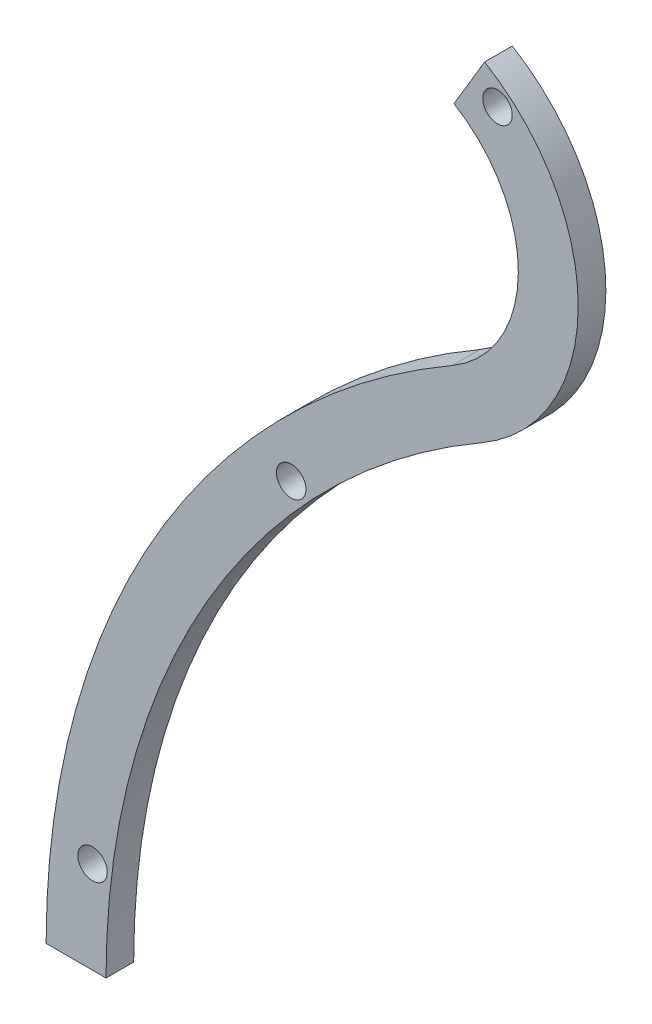
ISO-10303-21;
HEADER;
FILE_DESCRIPTION(('STEP AP214'),'2;1');
FILE_NAME('part.step','',(''),(''),'','','');
FILE_SCHEMA(('AUTOMOTIVE_DESIGN { 1 0 10303 214 1 1 1 1 }'));
ENDSEC;
DATA;
#1=APPLICATION_CONTEXT('core data for automotive mechanical design processes');
#2=APPLICATION_PROTOCOL_DEFINITION('international standard','automotive_design',2000,#1);
#3=PRODUCT_CONTEXT('',#1,'mechanical');
#4=PRODUCT('Part','Part','',(#3));
#5=PRODUCT_RELATED_PRODUCT_CATEGORY('part','',(#4));
#6=PRODUCT_DEFINITION_FORMATION('','',#4);
#7=PRODUCT_DEFINITION_CONTEXT('part definition',#1,'design');
#8=PRODUCT_DEFINITION('design','',#6,#7);
#9=PRODUCT_DEFINITION_SHAPE('','',#8);
#10=(LENGTH_UNIT() NAMED_UNIT(*) SI_UNIT(.MILLI.,.METRE.));
#11=(NAMED_UNIT(*) PLANE_ANGLE_UNIT() SI_UNIT($,.RADIAN.));
#12=(NAMED_UNIT(*) SI_UNIT($,.STERADIAN.) SOLID_ANGLE_UNIT());
#13=UNCERTAINTY_MEASURE_WITH_UNIT(LENGTH_MEASURE(1.E-05),#10,'distance_accuracy_value','');
#14=(GEOMETRIC_REPRESENTATION_CONTEXT(3) GLOBAL_UNCERTAINTY_ASSIGNED_CONTEXT((#13)) GLOBAL_UNIT_ASSIGNED_CONTEXT((#10,
#11,#12)) REPRESENTATION_CONTEXT('',''));
#15=CARTESIAN_POINT('',(0.,0.,0.));
#16=DIRECTION('',(0.,0.,1.));
#17=DIRECTION('',(1.,0.,0.));
#18=AXIS2_PLACEMENT_3D('',#15,#16,#17);
#19=CARTESIAN_POINT('',(0.,88.7564434701786,3.));
#20=DIRECTION('',(0.,0.,-1.));
#21=DIRECTION('',(-1.,0.,0.));
#22=AXIS2_PLACEMENT_3D('',#19,#20,#21);
#23=PLANE('',#22);
#24=CARTESIAN_POINT('',(0.,88.7564434701786,3.));
#25=DIRECTION('',(0.,0.,1.));
#26=DIRECTION('',(-1.,0.,0.));
#27=AXIS2_PLACEMENT_3D('',#24,#25,#26);
#28=CIRCLE('',#27,20.8093387441666);
#29=CARTESIAN_POINT('',(10.4046693720833,70.7350274817745,3.));
#30=VERTEX_POINT('',#29);
#31=CARTESIAN_POINT('',(10.6521258847209,106.632706869042,3.));
#32=VERTEX_POINT('',#31);
#33=EDGE_CURVE('E129',#30,#32,#28,.T.);
#34=ORIENTED_EDGE('',*,*,#33,.T.);
#35=DIRECTION('',(-0.511891608651282,-0.859050045685583,0.));
#36=VECTOR('',#35,1.);
#37=CARTESIAN_POINT('',(7.32483042848755,101.048881572085,3.));
#38=LINE('',#37,#36);
#39=CARTESIAN_POINT('',(7.32483042848755,101.048881572085,3.));
#40=VERTEX_POINT('',#39);
#41=EDGE_CURVE('E87',#32,#40,#38,.T.);
#42=ORIENTED_EDGE('',*,*,#41,.T.);
#43=CARTESIAN_POINT('',(0.,88.7564434701786,3.));
#44=DIRECTION('',(0.,0.,-1.));
#45=DIRECTION('',(-1.,0.,0.));
#46=AXIS2_PLACEMENT_3D('',#43,#44,#45);
#47=CIRCLE('',#46,14.3093387441666);
#48=CARTESIAN_POINT('',(7.15466937208328,76.3641926063734,3.));
#49=VERTEX_POINT('',#48);
#50=EDGE_CURVE('E100',#40,#49,#47,.T.);
#51=ORIENTED_EDGE('',*,*,#50,.T.);
#52=CARTESIAN_POINT('',(51.2435565298214,0.,3.));
#53=DIRECTION('',(0.,0.,1.));
#54=DIRECTION('',(1.,0.,0.));
#55=AXIS2_PLACEMENT_3D('',#52,#53,#54);
#56=CIRCLE('',#55,88.1777743154762);
#57=CARTESIAN_POINT('',(-36.9342177856549,0.,3.));
#58=VERTEX_POINT('',#57);
#59=EDGE_CURVE('E94',#49,#58,#56,.T.);
#60=ORIENTED_EDGE('',*,*,#59,.T.);
#61=DIRECTION('',(1.,0.,0.));
#62=VECTOR('',#61,1.);
#63=CARTESIAN_POINT('',(-36.9342177856549,0.,3.));
#64=LINE('',#63,#62);
#65=CARTESIAN_POINT('',(-30.4342177856549,0.,3.));
#66=VERTEX_POINT('',#65);
#67=EDGE_CURVE('E98',#58,#66,#64,.T.);
#68=ORIENTED_EDGE('',*,*,#67,.T.);
#69=CARTESIAN_POINT('',(51.2435565298214,0.,3.));
#70=DIRECTION('',(0.,0.,-1.));
#71=DIRECTION('',(1.,0.,0.));
#72=AXIS2_PLACEMENT_3D('',#69,#70,#71);
#73=CIRCLE('',#72,81.6777743154762);
#74=EDGE_CURVE('E50',#66,#30,#73,.T.);
#75=ORIENTED_EDGE('',*,*,#74,.T.);
#76=EDGE_LOOP('',(#34,#42,#51,#60,#68,#75));
#77=FACE_BOUND('',#76,.T.);
#78=CARTESIAN_POINT('',(12.0481258988284,103.114840794135,3.));
#79=DIRECTION('',(0.,0.,1.));
#80=DIRECTION('',(1.,0.,0.));
#81=AXIS2_PLACEMENT_3D('',#78,#79,#80);
#82=CIRCLE('',#81,1.6);
#83=CARTESIAN_POINT('',(13.6481258988284,103.114840794135,3.));
#84=VERTEX_POINT('',#83);
#85=EDGE_CURVE('E122',#84,#84,#82,.T.);
#86=ORIENTED_EDGE('',*,*,#85,.F.);
#87=EDGE_LOOP('',(#86));
#88=FACE_BOUND('',#87,.T.);
#89=CARTESIAN_POINT('',(-10.3376455214007,56.7515534077259,3.));
#90=DIRECTION('',(0.,0.,1.));
#91=DIRECTION('',(1.,0.,0.));
#92=AXIS2_PLACEMENT_3D('',#89,#90,#91);
#93=CIRCLE('',#92,1.6);
#94=CARTESIAN_POINT('',(-8.73764552140066,56.7515534077259,3.));
#95=VERTEX_POINT('',#94);
#96=EDGE_CURVE('E183',#95,#95,#93,.T.);
#97=ORIENTED_EDGE('',*,*,#96,.F.);
#98=EDGE_LOOP('',(#97));
#99=FACE_BOUND('',#98,.T.);
#100=CARTESIAN_POINT('',(-31.9007954146336,10.,3.));
#101=DIRECTION('',(0.,0.,1.));
#102=DIRECTION('',(1.,0.,0.));
#103=AXIS2_PLACEMENT_3D('',#100,#101,#102);
#104=CIRCLE('',#103,1.6);
#105=CARTESIAN_POINT('',(-30.3007954146336,10.,3.));
#106=VERTEX_POINT('',#105);
#107=EDGE_CURVE('E174',#106,#106,#104,.T.);
#108=ORIENTED_EDGE('',*,*,#107,.F.);
#109=EDGE_LOOP('',(#108));
#110=FACE_BOUND('',#109,.T.);
#111=ADVANCED_FACE('F33',(#77,#88,#99,#110),#23,.F.);
#112=CARTESIAN_POINT('',(0.,88.7564434701786,0.));
#113=DIRECTION('',(0.,0.,-1.));
#114=DIRECTION('',(-1.,0.,0.));
#115=AXIS2_PLACEMENT_3D('',#112,#113,#114);
#116=PLANE('',#115);
#117=CARTESIAN_POINT('',(-10.3376455214007,56.7515534077259,0.));
#118=DIRECTION('',(0.,0.,1.));
#119=DIRECTION('',(1.,0.,0.));
#120=AXIS2_PLACEMENT_3D('',#117,#118,#119);
#121=CIRCLE('',#120,1.6);
#122=CARTESIAN_POINT('',(-8.73764552140066,56.7515534077259,0.));
#123=VERTEX_POINT('',#122);
#124=EDGE_CURVE('E180',#123,#123,#121,.T.);
#125=ORIENTED_EDGE('',*,*,#124,.T.);
#126=EDGE_LOOP('',(#125));
#127=FACE_BOUND('',#126,.T.);
#128=CARTESIAN_POINT('',(0.,88.7564434701786,0.));
#129=DIRECTION('',(0.,0.,1.));
#130=DIRECTION('',(-1.,0.,0.));
#131=AXIS2_PLACEMENT_3D('',#128,#129,#130);
#132=CIRCLE('',#131,20.8093387441666);
#133=CARTESIAN_POINT('',(10.4046693720833,70.7350274817745,0.));
#134=VERTEX_POINT('',#133);
#135=CARTESIAN_POINT('',(10.6521258847209,106.632706869042,0.));
#136=VERTEX_POINT('',#135);
#137=EDGE_CURVE('E118',#134,#136,#132,.T.);
#138=ORIENTED_EDGE('',*,*,#137,.F.);
#139=CARTESIAN_POINT('',(51.2435565298214,0.,0.));
#140=DIRECTION('',(0.,0.,-1.));
#141=DIRECTION('',(1.,0.,0.));
#142=AXIS2_PLACEMENT_3D('',#139,#140,#141);
#143=CIRCLE('',#142,81.6777743154762);
#144=CARTESIAN_POINT('',(-30.4342177856549,0.,0.));
#145=VERTEX_POINT('',#144);
#146=EDGE_CURVE('E79',#145,#134,#143,.T.);
#147=ORIENTED_EDGE('',*,*,#146,.F.);
#148=DIRECTION('',(1.,0.,0.));
#149=VECTOR('',#148,1.);
#150=CARTESIAN_POINT('',(-36.9342177856549,0.,0.));
#151=LINE('',#150,#149);
#152=CARTESIAN_POINT('',(-36.9342177856549,0.,0.));
#153=VERTEX_POINT('',#152);
#154=EDGE_CURVE('E73',#153,#145,#151,.T.);
#155=ORIENTED_EDGE('',*,*,#154,.F.);
#156=CARTESIAN_POINT('',(51.2435565298214,0.,0.));
#157=DIRECTION('',(0.,0.,1.));
#158=DIRECTION('',(1.,0.,0.));
#159=AXIS2_PLACEMENT_3D('',#156,#157,#158);
#160=CIRCLE('',#159,88.1777743154762);
#161=CARTESIAN_POINT('',(7.15466937208328,76.3641926063734,0.));
#162=VERTEX_POINT('',#161);
#163=EDGE_CURVE('E108',#162,#153,#160,.T.);
#164=ORIENTED_EDGE('',*,*,#163,.F.);
#165=CARTESIAN_POINT('',(0.,88.7564434701786,0.));
#166=DIRECTION('',(0.,0.,-1.));
#167=DIRECTION('',(-1.,0.,0.));
#168=AXIS2_PLACEMENT_3D('',#165,#166,#167);
#169=CIRCLE('',#168,14.3093387441666);
#170=CARTESIAN_POINT('',(7.32483042848755,101.048881572085,0.));
#171=VERTEX_POINT('',#170);
#172=EDGE_CURVE('E124',#171,#162,#169,.T.);
#173=ORIENTED_EDGE('',*,*,#172,.F.);
#174=DIRECTION('',(-0.511891608651282,-0.859050045685583,0.));
#175=VECTOR('',#174,1.);
#176=CARTESIAN_POINT('',(7.32483042848755,101.048881572085,0.));
#177=LINE('',#176,#175);
#178=EDGE_CURVE('E121',#136,#171,#177,.T.);
#179=ORIENTED_EDGE('',*,*,#178,.F.);
#180=EDGE_LOOP('',(#138,#147,#155,#164,#173,#179));
#181=FACE_BOUND('',#180,.T.);
#182=CARTESIAN_POINT('',(12.0481258988284,103.114840794135,0.));
#183=DIRECTION('',(0.,0.,1.));
#184=DIRECTION('',(1.,0.,0.));
#185=AXIS2_PLACEMENT_3D('',#182,#183,#184);
#186=CIRCLE('',#185,1.6);
#187=CARTESIAN_POINT('',(13.6481258988284,103.114840794135,0.));
#188=VERTEX_POINT('',#187);
#189=EDGE_CURVE('E186',#188,#188,#186,.T.);
#190=ORIENTED_EDGE('',*,*,#189,.T.);
#191=EDGE_LOOP('',(#190));
#192=FACE_BOUND('',#191,.T.);
#193=CARTESIAN_POINT('',(-31.9007954146336,10.,0.));
#194=DIRECTION('',(0.,0.,1.));
#195=DIRECTION('',(1.,0.,0.));
#196=AXIS2_PLACEMENT_3D('',#193,#194,#195);
#197=CIRCLE('',#196,1.6);
#198=CARTESIAN_POINT('',(-30.3007954146336,10.,0.));
#199=VERTEX_POINT('',#198);
#200=EDGE_CURVE('E177',#199,#199,#197,.T.);
#201=ORIENTED_EDGE('',*,*,#200,.T.);
#202=EDGE_LOOP('',(#201));
#203=FACE_BOUND('',#202,.T.);
#204=ADVANCED_FACE('F138',(#127,#181,#192,#203),#116,.T.);
#205=CARTESIAN_POINT('',(0.,88.7564434701786,3.));
#206=DIRECTION('',(0.,0.,-1.));
#207=DIRECTION('',(-1.,0.,0.));
#208=AXIS2_PLACEMENT_3D('',#205,#206,#207);
#209=CYLINDRICAL_SURFACE('',#208,20.8093387441666);
#210=ORIENTED_EDGE('',*,*,#137,.T.);
#211=DIRECTION('',(0.,0.,-1.));
#212=VECTOR('',#211,1.);
#213=CARTESIAN_POINT('',(10.6521258847209,106.632706869042,3.));
#214=LINE('',#213,#212);
#215=EDGE_CURVE('E11',#32,#136,#214,.T.);
#216=ORIENTED_EDGE('',*,*,#215,.F.);
#217=ORIENTED_EDGE('',*,*,#33,.F.);
#218=DIRECTION('',(0.,0.,-1.));
#219=VECTOR('',#218,1.);
#220=CARTESIAN_POINT('',(10.4046693720833,70.7350274817745,3.));
#221=LINE('',#220,#219);
#222=EDGE_CURVE('E114',#30,#134,#221,.T.);
#223=ORIENTED_EDGE('',*,*,#222,.T.);
#224=EDGE_LOOP('',(#210,#216,#217,#223));
#225=FACE_BOUND('',#224,.T.);
#226=ADVANCED_FACE('F35',(#225),#209,.T.);
#227=CARTESIAN_POINT('',(7.32483042848755,101.048881572085,3.));
#228=DIRECTION('',(0.859050045685583,-0.511891608651282,0.));
#229=DIRECTION('',(0.511891608651282,0.859050045685583,0.));
#230=AXIS2_PLACEMENT_3D('',#227,#228,#229);
#231=PLANE('',#230);
#232=ORIENTED_EDGE('',*,*,#178,.T.);
#233=DIRECTION('',(0.,0.,-1.));
#234=VECTOR('',#233,1.);
#235=CARTESIAN_POINT('',(7.32483042848755,101.048881572085,3.));
#236=LINE('',#235,#234);
#237=EDGE_CURVE('E42',#40,#171,#236,.T.);
#238=ORIENTED_EDGE('',*,*,#237,.F.);
#239=ORIENTED_EDGE('',*,*,#41,.F.);
#240=ORIENTED_EDGE('',*,*,#215,.T.);
#241=EDGE_LOOP('',(#232,#238,#239,#240));
#242=FACE_BOUND('',#241,.T.);
#243=ADVANCED_FACE('F237',(#242),#231,.F.);
#244=CARTESIAN_POINT('',(0.,88.7564434701786,3.));
#245=DIRECTION('',(0.,0.,-1.));
#246=DIRECTION('',(-1.,0.,0.));
#247=AXIS2_PLACEMENT_3D('',#244,#245,#246);
#248=CYLINDRICAL_SURFACE('',#247,14.3093387441666);
#249=ORIENTED_EDGE('',*,*,#172,.T.);
#250=DIRECTION('',(0.,0.,-1.));
#251=VECTOR('',#250,1.);
#252=CARTESIAN_POINT('',(7.15466937208328,76.3641926063734,3.));
#253=LINE('',#252,#251);
#254=EDGE_CURVE('E109',#49,#162,#253,.T.);
#255=ORIENTED_EDGE('',*,*,#254,.F.);
#256=ORIENTED_EDGE('',*,*,#50,.F.);
#257=ORIENTED_EDGE('',*,*,#237,.T.);
#258=EDGE_LOOP('',(#249,#255,#256,#257));
#259=FACE_BOUND('',#258,.T.);
#260=ADVANCED_FACE('F135',(#259),#248,.F.);
#261=CARTESIAN_POINT('',(51.2435565298214,0.,3.));
#262=DIRECTION('',(0.,0.,-1.));
#263=DIRECTION('',(-1.,0.,0.));
#264=AXIS2_PLACEMENT_3D('',#261,#262,#263);
#265=CYLINDRICAL_SURFACE('',#264,88.1777743154762);
#266=ORIENTED_EDGE('',*,*,#163,.T.);
#267=DIRECTION('',(0.,0.,-1.));
#268=VECTOR('',#267,1.);
#269=CARTESIAN_POINT('',(-36.9342177856549,0.,3.));
#270=LINE('',#269,#268);
#271=EDGE_CURVE('E105',#58,#153,#270,.T.);
#272=ORIENTED_EDGE('',*,*,#271,.F.);
#273=ORIENTED_EDGE('',*,*,#59,.F.);
#274=ORIENTED_EDGE('',*,*,#254,.T.);
#275=EDGE_LOOP('',(#266,#272,#273,#274));
#276=FACE_BOUND('',#275,.T.);
#277=ADVANCED_FACE('F106',(#276),#265,.T.);
#278=CARTESIAN_POINT('',(-36.9342177856549,0.,3.));
#279=DIRECTION('',(0.,1.,0.));
#280=DIRECTION('',(0.,0.,1.));
#281=AXIS2_PLACEMENT_3D('',#278,#279,#280);
#282=PLANE('',#281);
#283=ORIENTED_EDGE('',*,*,#154,.T.);
#284=DIRECTION('',(0.,0.,-1.));
#285=VECTOR('',#284,1.);
#286=CARTESIAN_POINT('',(-30.4342177856549,0.,3.));
#287=LINE('',#286,#285);
#288=EDGE_CURVE('E110',#66,#145,#287,.T.);
#289=ORIENTED_EDGE('',*,*,#288,.F.);
#290=ORIENTED_EDGE('',*,*,#67,.F.);
#291=ORIENTED_EDGE('',*,*,#271,.T.);
#292=EDGE_LOOP('',(#283,#289,#290,#291));
#293=FACE_BOUND('',#292,.T.);
#294=ADVANCED_FACE('F112',(#293),#282,.F.);
#295=CARTESIAN_POINT('',(51.2435565298214,0.,3.));
#296=DIRECTION('',(0.,0.,-1.));
#297=DIRECTION('',(-1.,0.,0.));
#298=AXIS2_PLACEMENT_3D('',#295,#296,#297);
#299=CYLINDRICAL_SURFACE('',#298,81.6777743154762);
#300=ORIENTED_EDGE('',*,*,#146,.T.);
#301=ORIENTED_EDGE('',*,*,#222,.F.);
#302=ORIENTED_EDGE('',*,*,#74,.F.);
#303=ORIENTED_EDGE('',*,*,#288,.T.);
#304=EDGE_LOOP('',(#300,#301,#302,#303));
#305=FACE_BOUND('',#304,.T.);
#306=ADVANCED_FACE('F143',(#305),#299,.F.);
#307=CARTESIAN_POINT('',(12.0481258988284,103.114840794135,3.));
#308=DIRECTION('',(0.,0.,-1.));
#309=DIRECTION('',(-1.,0.,0.));
#310=AXIS2_PLACEMENT_3D('',#307,#308,#309);
#311=CYLINDRICAL_SURFACE('',#310,1.6);
#312=ORIENTED_EDGE('',*,*,#85,.T.);
#313=EDGE_LOOP('',(#312));
#314=FACE_BOUND('',#313,.T.);
#315=ORIENTED_EDGE('',*,*,#189,.F.);
#316=EDGE_LOOP('',(#315));
#317=FACE_BOUND('',#316,.T.);
#318=ADVANCED_FACE('F145',(#314,#317),#311,.F.);
#319=CARTESIAN_POINT('',(-10.3376455214007,56.7515534077259,3.));
#320=DIRECTION('',(0.,0.,-1.));
#321=DIRECTION('',(-1.,0.,0.));
#322=AXIS2_PLACEMENT_3D('',#319,#320,#321);
#323=CYLINDRICAL_SURFACE('',#322,1.6);
#324=ORIENTED_EDGE('',*,*,#96,.T.);
#325=EDGE_LOOP('',(#324));
#326=FACE_BOUND('',#325,.T.);
#327=ORIENTED_EDGE('',*,*,#124,.F.);
#328=EDGE_LOOP('',(#327));
#329=FACE_BOUND('',#328,.T.);
#330=ADVANCED_FACE('F151',(#326,#329),#323,.F.);
#331=CARTESIAN_POINT('',(-31.9007954146336,10.,3.));
#332=DIRECTION('',(0.,0.,-1.));
#333=DIRECTION('',(-1.,0.,0.));
#334=AXIS2_PLACEMENT_3D('',#331,#332,#333);
#335=CYLINDRICAL_SURFACE('',#334,1.6);
#336=ORIENTED_EDGE('',*,*,#107,.T.);
#337=EDGE_LOOP('',(#336));
#338=FACE_BOUND('',#337,.T.);
#339=ORIENTED_EDGE('',*,*,#200,.F.);
#340=EDGE_LOOP('',(#339));
#341=FACE_BOUND('',#340,.T.);
#342=ADVANCED_FACE('F165',(#338,#341),#335,.F.);
#343=CLOSED_SHELL('',(#111,#204,#226,#243,#260,#277,#294,#306,#318,#330,#342));
#344=MANIFOLD_SOLID_BREP('B2',#343);
#345=ADVANCED_BREP_SHAPE_REPRESENTATION('',(#18,#344),#14);
#346=SHAPE_DEFINITION_REPRESENTATION(#9,#345);
ENDSEC;
END-ISO-10303-21;
